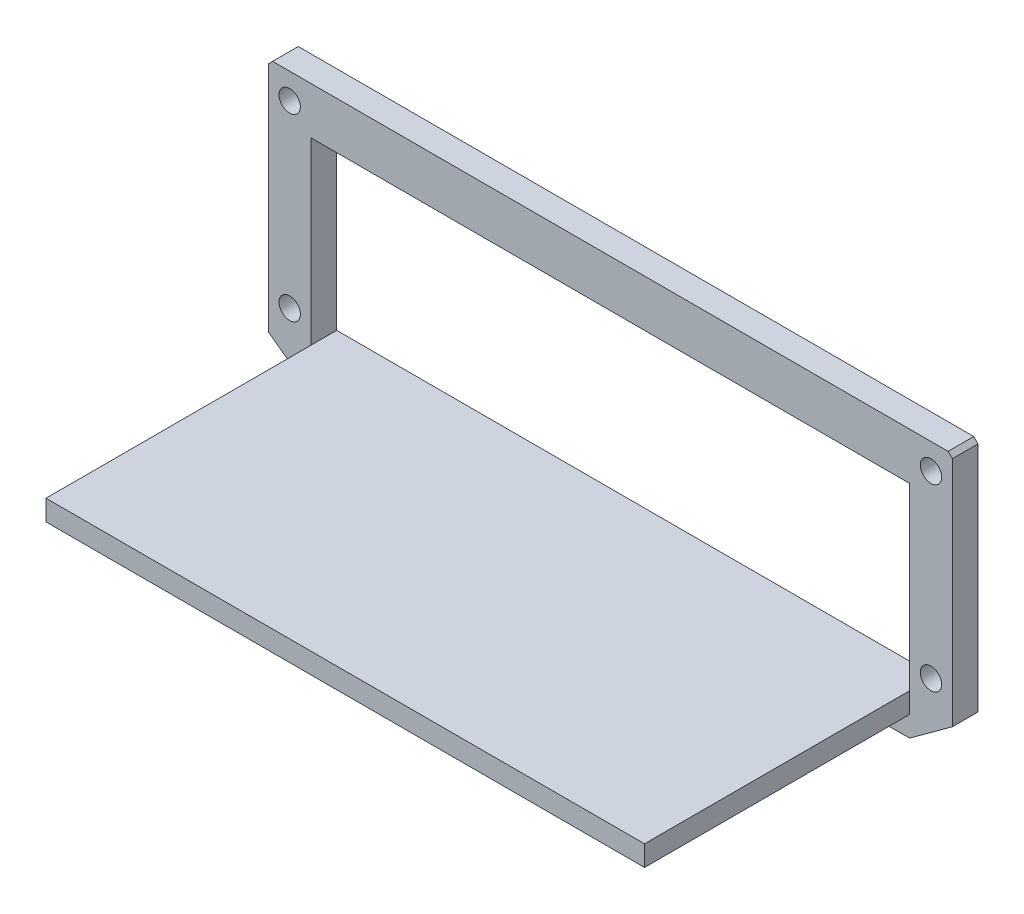
ISO-10303-21;
HEADER;
FILE_DESCRIPTION(('STEP AP214'),'2;1');
FILE_NAME('part.step','',(''),(''),'','','');
FILE_SCHEMA(('AUTOMOTIVE_DESIGN { 1 0 10303 214 1 1 1 1 }'));
ENDSEC;
DATA;
#1=APPLICATION_CONTEXT('core data for automotive mechanical design processes');
#2=APPLICATION_PROTOCOL_DEFINITION('international standard','automotive_design',2000,#1);
#3=PRODUCT_CONTEXT('',#1,'mechanical');
#4=PRODUCT('Part','Part','',(#3));
#5=PRODUCT_RELATED_PRODUCT_CATEGORY('part','',(#4));
#6=PRODUCT_DEFINITION_FORMATION('','',#4);
#7=PRODUCT_DEFINITION_CONTEXT('part definition',#1,'design');
#8=PRODUCT_DEFINITION('design','',#6,#7);
#9=PRODUCT_DEFINITION_SHAPE('','',#8);
#10=(LENGTH_UNIT() NAMED_UNIT(*) SI_UNIT(.MILLI.,.METRE.));
#11=(NAMED_UNIT(*) PLANE_ANGLE_UNIT() SI_UNIT($,.RADIAN.));
#12=(NAMED_UNIT(*) SI_UNIT($,.STERADIAN.) SOLID_ANGLE_UNIT());
#13=UNCERTAINTY_MEASURE_WITH_UNIT(LENGTH_MEASURE(1.E-05),#10,'distance_accuracy_value','');
#14=(GEOMETRIC_REPRESENTATION_CONTEXT(3) GLOBAL_UNCERTAINTY_ASSIGNED_CONTEXT((#13)) GLOBAL_UNIT_ASSIGNED_CONTEXT((#10,
#11,#12)) REPRESENTATION_CONTEXT('',''));
#15=CARTESIAN_POINT('',(0.,0.,0.));
#16=DIRECTION('',(0.,0.,1.));
#17=DIRECTION('',(1.,0.,0.));
#18=AXIS2_PLACEMENT_3D('',#15,#16,#17);
#19=CARTESIAN_POINT('',(-40.,-17.,3.));
#20=DIRECTION('',(0.,0.,1.));
#21=DIRECTION('',(1.,0.,0.));
#22=AXIS2_PLACEMENT_3D('',#19,#20,#21);
#23=PLANE('',#22);
#24=DIRECTION('',(0.,-1.,0.));
#25=VECTOR('',#24,1.);
#26=CARTESIAN_POINT('',(-35.,-11.5,3.));
#27=LINE('',#26,#25);
#28=CARTESIAN_POINT('',(-35.,-9.5,3.));
#29=VERTEX_POINT('',#28);
#30=CARTESIAN_POINT('',(-35.,-11.9,3.));
#31=VERTEX_POINT('',#30);
#32=EDGE_CURVE('E158',#29,#31,#27,.T.);
#33=ORIENTED_EDGE('',*,*,#32,.F.);
#34=DIRECTION('',(0.,-1.,0.));
#35=VECTOR('',#34,1.);
#36=CARTESIAN_POINT('',(-35.,11.5,3.));
#37=LINE('',#36,#35);
#38=CARTESIAN_POINT('',(-35.,11.5,3.));
#39=VERTEX_POINT('',#38);
#40=EDGE_CURVE('E221',#39,#29,#37,.T.);
#41=ORIENTED_EDGE('',*,*,#40,.F.);
#42=DIRECTION('',(-1.,0.,0.));
#43=VECTOR('',#42,1.);
#44=CARTESIAN_POINT('',(-35.,11.5,3.));
#45=LINE('',#44,#43);
#46=CARTESIAN_POINT('',(35.,11.5,3.));
#47=VERTEX_POINT('',#46);
#48=EDGE_CURVE('E234',#47,#39,#45,.T.);
#49=ORIENTED_EDGE('',*,*,#48,.F.);
#50=DIRECTION('',(0.,1.,0.));
#51=VECTOR('',#50,1.);
#52=CARTESIAN_POINT('',(35.,11.5,3.));
#53=LINE('',#52,#51);
#54=CARTESIAN_POINT('',(35.,-9.5,3.));
#55=VERTEX_POINT('',#54);
#56=EDGE_CURVE('E232',#55,#47,#53,.T.);
#57=ORIENTED_EDGE('',*,*,#56,.F.);
#58=DIRECTION('',(0.,1.,0.));
#59=VECTOR('',#58,1.);
#60=CARTESIAN_POINT('',(35.,-11.9,3.));
#61=LINE('',#60,#59);
#62=CARTESIAN_POINT('',(35.,-11.9,3.));
#63=VERTEX_POINT('',#62);
#64=EDGE_CURVE('E55',#63,#55,#61,.T.);
#65=ORIENTED_EDGE('',*,*,#64,.F.);
#66=DIRECTION('',(1.,0.,0.));
#67=VECTOR('',#66,1.);
#68=CARTESIAN_POINT('',(-35.,-11.9,3.));
#69=LINE('',#68,#67);
#70=EDGE_CURVE('E50',#31,#63,#69,.T.);
#71=ORIENTED_EDGE('',*,*,#70,.F.);
#72=EDGE_LOOP('',(#33,#41,#49,#57,#65,#71));
#73=FACE_BOUND('',#72,.T.);
#74=DIRECTION('',(0.807621374925712,0.589701377616758,0.));
#75=VECTOR('',#74,1.);
#76=CARTESIAN_POINT('',(40.,-10.6491470389141,3.));
#77=LINE('',#76,#75);
#78=CARTESIAN_POINT('',(35.,-14.3,3.));
#79=VERTEX_POINT('',#78);
#80=CARTESIAN_POINT('',(40.,-10.6491470389141,3.));
#81=VERTEX_POINT('',#80);
#82=EDGE_CURVE('E189',#79,#81,#77,.T.);
#83=ORIENTED_EDGE('',*,*,#82,.T.);
#84=DIRECTION('',(0.,1.,0.));
#85=VECTOR('',#84,1.);
#86=CARTESIAN_POINT('',(40.,17.,3.));
#87=LINE('',#86,#85);
#88=CARTESIAN_POINT('',(40.,16.5,3.));
#89=VERTEX_POINT('',#88);
#90=EDGE_CURVE('E244',#81,#89,#87,.T.);
#91=ORIENTED_EDGE('',*,*,#90,.T.);
#92=DIRECTION('',(0.707106781186543,-0.707106781186552,0.));
#93=VECTOR('',#92,1.);
#94=CARTESIAN_POINT('',(16.7500000000006,39.7499999999998,3.));
#95=LINE('',#94,#93);
#96=CARTESIAN_POINT('',(39.5,17.,3.));
#97=VERTEX_POINT('',#96);
#98=EDGE_CURVE('E268',#89,#97,#95,.F.);
#99=ORIENTED_EDGE('',*,*,#98,.T.);
#100=DIRECTION('',(-1.,0.,0.));
#101=VECTOR('',#100,1.);
#102=CARTESIAN_POINT('',(-40.,17.,3.));
#103=LINE('',#102,#101);
#104=CARTESIAN_POINT('',(-39.5,17.,3.));
#105=VERTEX_POINT('',#104);
#106=EDGE_CURVE('E247',#97,#105,#103,.T.);
#107=ORIENTED_EDGE('',*,*,#106,.T.);
#108=DIRECTION('',(0.707106781186552,0.707106781186543,0.));
#109=VECTOR('',#108,1.);
#110=CARTESIAN_POINT('',(-56.75,-0.249999999999764,3.));
#111=LINE('',#110,#109);
#112=CARTESIAN_POINT('',(-40.,16.5,3.));
#113=VERTEX_POINT('',#112);
#114=EDGE_CURVE('E270',#105,#113,#111,.F.);
#115=ORIENTED_EDGE('',*,*,#114,.T.);
#116=DIRECTION('',(0.,-1.,0.));
#117=VECTOR('',#116,1.);
#118=CARTESIAN_POINT('',(-40.,17.,3.));
#119=LINE('',#118,#117);
#120=CARTESIAN_POINT('',(-40.,-10.6491470389141,3.));
#121=VERTEX_POINT('',#120);
#122=EDGE_CURVE('E241',#113,#121,#119,.T.);
#123=ORIENTED_EDGE('',*,*,#122,.T.);
#124=DIRECTION('',(0.807621374925712,-0.589701377616758,0.));
#125=VECTOR('',#124,1.);
#126=CARTESIAN_POINT('',(-35.,-14.3,3.));
#127=LINE('',#126,#125);
#128=CARTESIAN_POINT('',(-35.,-14.3,3.));
#129=VERTEX_POINT('',#128);
#130=EDGE_CURVE('E180',#121,#129,#127,.T.);
#131=ORIENTED_EDGE('',*,*,#130,.T.);
#132=DIRECTION('',(1.,0.,0.));
#133=VECTOR('',#132,1.);
#134=CARTESIAN_POINT('',(-35.,-14.3,3.));
#135=LINE('',#134,#133);
#136=EDGE_CURVE('E173',#129,#79,#135,.T.);
#137=ORIENTED_EDGE('',*,*,#136,.T.);
#138=EDGE_LOOP('',(#83,#91,#99,#107,#115,#123,#131,#137));
#139=FACE_BOUND('',#138,.T.);
#140=CARTESIAN_POINT('',(37.5,-6.99999999999999,3.));
#141=DIRECTION('',(0.,0.,-1.));
#142=DIRECTION('',(-1.,0.,0.));
#143=AXIS2_PLACEMENT_3D('',#140,#141,#142);
#144=CIRCLE('',#143,1.25);
#145=CARTESIAN_POINT('',(36.25,-6.99999999999999,3.));
#146=VERTEX_POINT('',#145);
#147=EDGE_CURVE('E218',#146,#146,#144,.T.);
#148=ORIENTED_EDGE('',*,*,#147,.T.);
#149=EDGE_LOOP('',(#148));
#150=FACE_BOUND('',#149,.T.);
#151=CARTESIAN_POINT('',(37.5,14.,3.));
#152=DIRECTION('',(0.,0.,-1.));
#153=DIRECTION('',(-1.,0.,0.));
#154=AXIS2_PLACEMENT_3D('',#151,#152,#153);
#155=CIRCLE('',#154,1.25);
#156=CARTESIAN_POINT('',(36.25,14.,3.));
#157=VERTEX_POINT('',#156);
#158=EDGE_CURVE('E212',#157,#157,#155,.T.);
#159=ORIENTED_EDGE('',*,*,#158,.T.);
#160=EDGE_LOOP('',(#159));
#161=FACE_BOUND('',#160,.T.);
#162=CARTESIAN_POINT('',(-37.5,14.,3.));
#163=DIRECTION('',(0.,0.,-1.));
#164=DIRECTION('',(-1.,0.,0.));
#165=AXIS2_PLACEMENT_3D('',#162,#163,#164);
#166=CIRCLE('',#165,1.25);
#167=CARTESIAN_POINT('',(-38.75,14.,3.));
#168=VERTEX_POINT('',#167);
#169=EDGE_CURVE('E206',#168,#168,#166,.T.);
#170=ORIENTED_EDGE('',*,*,#169,.T.);
#171=EDGE_LOOP('',(#170));
#172=FACE_BOUND('',#171,.T.);
#173=CARTESIAN_POINT('',(-37.5,-7.,3.));
#174=DIRECTION('',(0.,0.,-1.));
#175=DIRECTION('',(-1.,0.,0.));
#176=AXIS2_PLACEMENT_3D('',#173,#174,#175);
#177=CIRCLE('',#176,1.25);
#178=CARTESIAN_POINT('',(-38.75,-7.,3.));
#179=VERTEX_POINT('',#178);
#180=EDGE_CURVE('E200',#179,#179,#177,.T.);
#181=ORIENTED_EDGE('',*,*,#180,.T.);
#182=EDGE_LOOP('',(#181));
#183=FACE_BOUND('',#182,.T.);
#184=ADVANCED_FACE('F35',(#73,#139,#150,#161,#172,#183),#23,.T.);
#185=CARTESIAN_POINT('',(-40.,-17.,0.));
#186=DIRECTION('',(0.,0.,1.));
#187=DIRECTION('',(1.,0.,0.));
#188=AXIS2_PLACEMENT_3D('',#185,#186,#187);
#189=PLANE('',#188);
#190=DIRECTION('',(0.,1.,0.));
#191=VECTOR('',#190,1.);
#192=CARTESIAN_POINT('',(-35.,11.5,0.));
#193=LINE('',#192,#191);
#194=CARTESIAN_POINT('',(-35.,-9.5,0.));
#195=VERTEX_POINT('',#194);
#196=CARTESIAN_POINT('',(-35.,11.5,0.));
#197=VERTEX_POINT('',#196);
#198=EDGE_CURVE('E227',#195,#197,#193,.T.);
#199=ORIENTED_EDGE('',*,*,#198,.F.);
#200=DIRECTION('',(-1.,0.,0.));
#201=VECTOR('',#200,1.);
#202=CARTESIAN_POINT('',(-35.,-9.5,0.));
#203=LINE('',#202,#201);
#204=CARTESIAN_POINT('',(35.,-9.5,0.));
#205=VERTEX_POINT('',#204);
#206=EDGE_CURVE('E161',#205,#195,#203,.T.);
#207=ORIENTED_EDGE('',*,*,#206,.F.);
#208=DIRECTION('',(0.,-1.,0.));
#209=VECTOR('',#208,1.);
#210=CARTESIAN_POINT('',(35.,11.5,0.));
#211=LINE('',#210,#209);
#212=CARTESIAN_POINT('',(35.,11.5,0.));
#213=VERTEX_POINT('',#212);
#214=EDGE_CURVE('E222',#213,#205,#211,.T.);
#215=ORIENTED_EDGE('',*,*,#214,.F.);
#216=DIRECTION('',(1.,0.,0.));
#217=VECTOR('',#216,1.);
#218=CARTESIAN_POINT('',(-35.,11.5,0.));
#219=LINE('',#218,#217);
#220=EDGE_CURVE('E224',#197,#213,#219,.T.);
#221=ORIENTED_EDGE('',*,*,#220,.F.);
#222=EDGE_LOOP('',(#199,#207,#215,#221));
#223=FACE_BOUND('',#222,.T.);
#224=DIRECTION('',(0.807621374925712,-0.589701377616758,0.));
#225=VECTOR('',#224,1.);
#226=CARTESIAN_POINT('',(-35.,-14.3,0.));
#227=LINE('',#226,#225);
#228=CARTESIAN_POINT('',(-40.,-10.6491470389141,0.));
#229=VERTEX_POINT('',#228);
#230=CARTESIAN_POINT('',(-35.,-14.3,0.));
#231=VERTEX_POINT('',#230);
#232=EDGE_CURVE('E183',#229,#231,#227,.T.);
#233=ORIENTED_EDGE('',*,*,#232,.F.);
#234=DIRECTION('',(0.,-1.,0.));
#235=VECTOR('',#234,1.);
#236=CARTESIAN_POINT('',(-40.,17.,0.));
#237=LINE('',#236,#235);
#238=CARTESIAN_POINT('',(-40.,16.5,0.));
#239=VERTEX_POINT('',#238);
#240=EDGE_CURVE('E229',#239,#229,#237,.T.);
#241=ORIENTED_EDGE('',*,*,#240,.F.);
#242=DIRECTION('',(-0.707106781186552,-0.707106781186543,0.));
#243=VECTOR('',#242,1.);
#244=CARTESIAN_POINT('',(-40.,16.5,0.));
#245=LINE('',#244,#243);
#246=CARTESIAN_POINT('',(-39.5,17.,0.));
#247=VERTEX_POINT('',#246);
#248=EDGE_CURVE('E261',#239,#247,#245,.F.);
#249=ORIENTED_EDGE('',*,*,#248,.T.);
#250=DIRECTION('',(-1.,0.,0.));
#251=VECTOR('',#250,1.);
#252=CARTESIAN_POINT('',(-40.,17.,0.));
#253=LINE('',#252,#251);
#254=CARTESIAN_POINT('',(39.5,17.,0.));
#255=VERTEX_POINT('',#254);
#256=EDGE_CURVE('E245',#255,#247,#253,.T.);
#257=ORIENTED_EDGE('',*,*,#256,.F.);
#258=DIRECTION('',(-0.707106781186543,0.707106781186552,0.));
#259=VECTOR('',#258,1.);
#260=CARTESIAN_POINT('',(39.5,17.,0.));
#261=LINE('',#260,#259);
#262=CARTESIAN_POINT('',(40.,16.5,0.));
#263=VERTEX_POINT('',#262);
#264=EDGE_CURVE('E258',#255,#263,#261,.F.);
#265=ORIENTED_EDGE('',*,*,#264,.T.);
#266=DIRECTION('',(0.,1.,0.));
#267=VECTOR('',#266,1.);
#268=CARTESIAN_POINT('',(40.,17.,0.));
#269=LINE('',#268,#267);
#270=CARTESIAN_POINT('',(40.,-10.6491470389141,0.));
#271=VERTEX_POINT('',#270);
#272=EDGE_CURVE('E252',#271,#263,#269,.T.);
#273=ORIENTED_EDGE('',*,*,#272,.F.);
#274=DIRECTION('',(0.807621374925712,0.589701377616758,0.));
#275=VECTOR('',#274,1.);
#276=CARTESIAN_POINT('',(40.,-10.6491470389141,0.));
#277=LINE('',#276,#275);
#278=CARTESIAN_POINT('',(35.,-14.3,0.));
#279=VERTEX_POINT('',#278);
#280=EDGE_CURVE('E179',#279,#271,#277,.T.);
#281=ORIENTED_EDGE('',*,*,#280,.F.);
#282=DIRECTION('',(1.,0.,0.));
#283=VECTOR('',#282,1.);
#284=CARTESIAN_POINT('',(-35.,-14.3,0.));
#285=LINE('',#284,#283);
#286=EDGE_CURVE('E176',#231,#279,#285,.T.);
#287=ORIENTED_EDGE('',*,*,#286,.F.);
#288=EDGE_LOOP('',(#233,#241,#249,#257,#265,#273,#281,#287));
#289=FACE_BOUND('',#288,.T.);
#290=CARTESIAN_POINT('',(-37.5,-7.,0.));
#291=DIRECTION('',(0.,0.,-1.));
#292=DIRECTION('',(-1.,0.,0.));
#293=AXIS2_PLACEMENT_3D('',#290,#291,#292);
#294=CIRCLE('',#293,1.25);
#295=CARTESIAN_POINT('',(-38.75,-7.,0.));
#296=VERTEX_POINT('',#295);
#297=EDGE_CURVE('E196',#296,#296,#294,.T.);
#298=ORIENTED_EDGE('',*,*,#297,.F.);
#299=EDGE_LOOP('',(#298));
#300=FACE_BOUND('',#299,.T.);
#301=CARTESIAN_POINT('',(37.5,14.,0.));
#302=DIRECTION('',(0.,0.,-1.));
#303=DIRECTION('',(-1.,0.,0.));
#304=AXIS2_PLACEMENT_3D('',#301,#302,#303);
#305=CIRCLE('',#304,1.25);
#306=CARTESIAN_POINT('',(36.25,14.,0.));
#307=VERTEX_POINT('',#306);
#308=EDGE_CURVE('E209',#307,#307,#305,.T.);
#309=ORIENTED_EDGE('',*,*,#308,.F.);
#310=EDGE_LOOP('',(#309));
#311=FACE_BOUND('',#310,.T.);
#312=CARTESIAN_POINT('',(37.5,-6.99999999999999,0.));
#313=DIRECTION('',(0.,0.,-1.));
#314=DIRECTION('',(-1.,0.,0.));
#315=AXIS2_PLACEMENT_3D('',#312,#313,#314);
#316=CIRCLE('',#315,1.25);
#317=CARTESIAN_POINT('',(36.25,-6.99999999999999,0.));
#318=VERTEX_POINT('',#317);
#319=EDGE_CURVE('E215',#318,#318,#316,.T.);
#320=ORIENTED_EDGE('',*,*,#319,.F.);
#321=EDGE_LOOP('',(#320));
#322=FACE_BOUND('',#321,.T.);
#323=CARTESIAN_POINT('',(-37.5,14.,0.));
#324=DIRECTION('',(0.,0.,-1.));
#325=DIRECTION('',(-1.,0.,0.));
#326=AXIS2_PLACEMENT_3D('',#323,#324,#325);
#327=CIRCLE('',#326,1.25);
#328=CARTESIAN_POINT('',(-38.75,14.,0.));
#329=VERTEX_POINT('',#328);
#330=EDGE_CURVE('E203',#329,#329,#327,.T.);
#331=ORIENTED_EDGE('',*,*,#330,.F.);
#332=EDGE_LOOP('',(#331));
#333=FACE_BOUND('',#332,.T.);
#334=ADVANCED_FACE('F283',(#223,#289,#300,#311,#322,#333),#189,.F.);
#335=CARTESIAN_POINT('',(-40.,17.,3.));
#336=DIRECTION('',(1.,0.,0.));
#337=DIRECTION('',(0.,0.,-1.));
#338=AXIS2_PLACEMENT_3D('',#335,#336,#337);
#339=PLANE('',#338);
#340=ORIENTED_EDGE('',*,*,#240,.T.);
#341=DIRECTION('',(0.,0.,1.));
#342=VECTOR('',#341,1.);
#343=CARTESIAN_POINT('',(-40.,-10.6491470389141,3.));
#344=LINE('',#343,#342);
#345=EDGE_CURVE('E11',#229,#121,#344,.T.);
#346=ORIENTED_EDGE('',*,*,#345,.T.);
#347=ORIENTED_EDGE('',*,*,#122,.F.);
#348=DIRECTION('',(0.,0.,-1.));
#349=VECTOR('',#348,1.);
#350=CARTESIAN_POINT('',(-40.,16.5,3.));
#351=LINE('',#350,#349);
#352=EDGE_CURVE('E250',#113,#239,#351,.T.);
#353=ORIENTED_EDGE('',*,*,#352,.T.);
#354=EDGE_LOOP('',(#340,#346,#347,#353));
#355=FACE_BOUND('',#354,.T.);
#356=ADVANCED_FACE('F299',(#355),#339,.F.);
#357=CARTESIAN_POINT('',(40.,17.,3.));
#358=DIRECTION('',(-1.,0.,0.));
#359=DIRECTION('',(0.,0.,1.));
#360=AXIS2_PLACEMENT_3D('',#357,#358,#359);
#361=PLANE('',#360);
#362=ORIENTED_EDGE('',*,*,#90,.F.);
#363=DIRECTION('',(0.,0.,-1.));
#364=VECTOR('',#363,1.);
#365=CARTESIAN_POINT('',(40.,-10.6491470389141,3.));
#366=LINE('',#365,#364);
#367=EDGE_CURVE('E43',#81,#271,#366,.T.);
#368=ORIENTED_EDGE('',*,*,#367,.T.);
#369=ORIENTED_EDGE('',*,*,#272,.T.);
#370=DIRECTION('',(0.,0.,1.));
#371=VECTOR('',#370,1.);
#372=CARTESIAN_POINT('',(40.,16.5,3.));
#373=LINE('',#372,#371);
#374=EDGE_CURVE('E272',#263,#89,#373,.T.);
#375=ORIENTED_EDGE('',*,*,#374,.T.);
#376=EDGE_LOOP('',(#362,#368,#369,#375));
#377=FACE_BOUND('',#376,.T.);
#378=ADVANCED_FACE('F277',(#377),#361,.F.);
#379=CARTESIAN_POINT('',(-40.,17.,3.));
#380=DIRECTION('',(0.,-1.,0.));
#381=DIRECTION('',(0.,0.,-1.));
#382=AXIS2_PLACEMENT_3D('',#379,#380,#381);
#383=PLANE('',#382);
#384=ORIENTED_EDGE('',*,*,#256,.T.);
#385=DIRECTION('',(0.,0.,1.));
#386=VECTOR('',#385,1.);
#387=CARTESIAN_POINT('',(-39.5,17.,3.));
#388=LINE('',#387,#386);
#389=EDGE_CURVE('E266',#247,#105,#388,.T.);
#390=ORIENTED_EDGE('',*,*,#389,.T.);
#391=ORIENTED_EDGE('',*,*,#106,.F.);
#392=DIRECTION('',(0.,0.,-1.));
#393=VECTOR('',#392,1.);
#394=CARTESIAN_POINT('',(39.5,17.,3.));
#395=LINE('',#394,#393);
#396=EDGE_CURVE('E263',#97,#255,#395,.T.);
#397=ORIENTED_EDGE('',*,*,#396,.T.);
#398=EDGE_LOOP('',(#384,#390,#391,#397));
#399=FACE_BOUND('',#398,.T.);
#400=ADVANCED_FACE('F309',(#399),#383,.F.);
#401=CARTESIAN_POINT('',(-35.,11.5,-73.6817480791546));
#402=DIRECTION('',(-1.,0.,0.));
#403=DIRECTION('',(0.,0.,1.));
#404=AXIS2_PLACEMENT_3D('',#401,#402,#403);
#405=PLANE('',#404);
#406=ORIENTED_EDGE('',*,*,#40,.T.);
#407=DIRECTION('',(0.,0.,1.));
#408=VECTOR('',#407,1.);
#409=CARTESIAN_POINT('',(-35.,-9.5,0.));
#410=LINE('',#409,#408);
#411=EDGE_CURVE('E170',#195,#29,#410,.T.);
#412=ORIENTED_EDGE('',*,*,#411,.F.);
#413=ORIENTED_EDGE('',*,*,#198,.T.);
#414=DIRECTION('',(0.,0.,1.));
#415=VECTOR('',#414,1.);
#416=CARTESIAN_POINT('',(-35.,11.5,-73.6817480791546));
#417=LINE('',#416,#415);
#418=EDGE_CURVE('E225',#197,#39,#417,.T.);
#419=ORIENTED_EDGE('',*,*,#418,.T.);
#420=EDGE_LOOP('',(#406,#412,#413,#419));
#421=FACE_BOUND('',#420,.T.);
#422=ADVANCED_FACE('F332',(#421),#405,.F.);
#423=CARTESIAN_POINT('',(-35.,11.5,-73.6817480791546));
#424=DIRECTION('',(0.,1.,0.));
#425=DIRECTION('',(0.,0.,1.));
#426=AXIS2_PLACEMENT_3D('',#423,#424,#425);
#427=PLANE('',#426);
#428=ORIENTED_EDGE('',*,*,#220,.T.);
#429=DIRECTION('',(0.,0.,1.));
#430=VECTOR('',#429,1.);
#431=CARTESIAN_POINT('',(35.,11.5,-73.6817480791546));
#432=LINE('',#431,#430);
#433=EDGE_CURVE('E237',#213,#47,#432,.T.);
#434=ORIENTED_EDGE('',*,*,#433,.T.);
#435=ORIENTED_EDGE('',*,*,#48,.T.);
#436=ORIENTED_EDGE('',*,*,#418,.F.);
#437=EDGE_LOOP('',(#428,#434,#435,#436));
#438=FACE_BOUND('',#437,.T.);
#439=ADVANCED_FACE('F361',(#438),#427,.F.);
#440=CARTESIAN_POINT('',(35.,11.5,-73.6817480791546));
#441=DIRECTION('',(1.,0.,0.));
#442=DIRECTION('',(0.,0.,-1.));
#443=AXIS2_PLACEMENT_3D('',#440,#441,#442);
#444=PLANE('',#443);
#445=ORIENTED_EDGE('',*,*,#214,.T.);
#446=DIRECTION('',(0.,0.,1.));
#447=VECTOR('',#446,1.);
#448=CARTESIAN_POINT('',(35.,-9.5,0.));
#449=LINE('',#448,#447);
#450=EDGE_CURVE('E164',#205,#55,#449,.T.);
#451=ORIENTED_EDGE('',*,*,#450,.T.);
#452=ORIENTED_EDGE('',*,*,#56,.T.);
#453=ORIENTED_EDGE('',*,*,#433,.F.);
#454=EDGE_LOOP('',(#445,#451,#452,#453));
#455=FACE_BOUND('',#454,.T.);
#456=ADVANCED_FACE('F322',(#455),#444,.F.);
#457=CARTESIAN_POINT('',(-40.,16.5,3.));
#458=DIRECTION('',(0.707106781186542,-0.707106781186552,0.));
#459=DIRECTION('',(0.707106781186552,0.707106781186543,0.));
#460=AXIS2_PLACEMENT_3D('',#457,#458,#459);
#461=PLANE('',#460);
#462=ORIENTED_EDGE('',*,*,#114,.F.);
#463=ORIENTED_EDGE('',*,*,#389,.F.);
#464=ORIENTED_EDGE('',*,*,#248,.F.);
#465=ORIENTED_EDGE('',*,*,#352,.F.);
#466=EDGE_LOOP('',(#462,#463,#464,#465));
#467=FACE_BOUND('',#466,.T.);
#468=ADVANCED_FACE('F307',(#467),#461,.F.);
#469=CARTESIAN_POINT('',(39.5,17.,3.));
#470=DIRECTION('',(-0.707106781186552,-0.707106781186543,0.));
#471=DIRECTION('',(0.707106781186543,-0.707106781186552,0.));
#472=AXIS2_PLACEMENT_3D('',#469,#470,#471);
#473=PLANE('',#472);
#474=ORIENTED_EDGE('',*,*,#98,.F.);
#475=ORIENTED_EDGE('',*,*,#374,.F.);
#476=ORIENTED_EDGE('',*,*,#264,.F.);
#477=ORIENTED_EDGE('',*,*,#396,.F.);
#478=EDGE_LOOP('',(#474,#475,#476,#477));
#479=FACE_BOUND('',#478,.T.);
#480=ADVANCED_FACE('F37',(#479),#473,.F.);
#481=CARTESIAN_POINT('',(37.5,-6.99999999999999,0.));
#482=DIRECTION('',(0.,0.,-1.));
#483=DIRECTION('',(-1.,0.,0.));
#484=AXIS2_PLACEMENT_3D('',#481,#482,#483);
#485=CYLINDRICAL_SURFACE('',#484,1.25);
#486=ORIENTED_EDGE('',*,*,#147,.F.);
#487=EDGE_LOOP('',(#486));
#488=FACE_BOUND('',#487,.T.);
#489=ORIENTED_EDGE('',*,*,#319,.T.);
#490=EDGE_LOOP('',(#489));
#491=FACE_BOUND('',#490,.T.);
#492=ADVANCED_FACE('F314',(#488,#491),#485,.F.);
#493=CARTESIAN_POINT('',(37.5,14.,0.));
#494=DIRECTION('',(0.,0.,-1.));
#495=DIRECTION('',(-1.,0.,0.));
#496=AXIS2_PLACEMENT_3D('',#493,#494,#495);
#497=CYLINDRICAL_SURFACE('',#496,1.25);
#498=ORIENTED_EDGE('',*,*,#158,.F.);
#499=EDGE_LOOP('',(#498));
#500=FACE_BOUND('',#499,.T.);
#501=ORIENTED_EDGE('',*,*,#308,.T.);
#502=EDGE_LOOP('',(#501));
#503=FACE_BOUND('',#502,.T.);
#504=ADVANCED_FACE('F319',(#500,#503),#497,.F.);
#505=CARTESIAN_POINT('',(-37.5,14.,0.));
#506=DIRECTION('',(0.,0.,-1.));
#507=DIRECTION('',(-1.,0.,0.));
#508=AXIS2_PLACEMENT_3D('',#505,#506,#507);
#509=CYLINDRICAL_SURFACE('',#508,1.25);
#510=ORIENTED_EDGE('',*,*,#169,.F.);
#511=EDGE_LOOP('',(#510));
#512=FACE_BOUND('',#511,.T.);
#513=ORIENTED_EDGE('',*,*,#330,.T.);
#514=EDGE_LOOP('',(#513));
#515=FACE_BOUND('',#514,.T.);
#516=ADVANCED_FACE('F403',(#512,#515),#509,.F.);
#517=CARTESIAN_POINT('',(-37.5,-7.,0.));
#518=DIRECTION('',(0.,0.,-1.));
#519=DIRECTION('',(-1.,0.,0.));
#520=AXIS2_PLACEMENT_3D('',#517,#518,#519);
#521=CYLINDRICAL_SURFACE('',#520,1.25);
#522=ORIENTED_EDGE('',*,*,#180,.F.);
#523=EDGE_LOOP('',(#522));
#524=FACE_BOUND('',#523,.T.);
#525=ORIENTED_EDGE('',*,*,#297,.T.);
#526=EDGE_LOOP('',(#525));
#527=FACE_BOUND('',#526,.T.);
#528=ADVANCED_FACE('F412',(#524,#527),#521,.F.);
#529=CARTESIAN_POINT('',(-35.,-14.3,0.));
#530=DIRECTION('',(0.,-1.,0.));
#531=DIRECTION('',(0.,0.,-1.));
#532=AXIS2_PLACEMENT_3D('',#529,#530,#531);
#533=PLANE('',#532);
#534=ORIENTED_EDGE('',*,*,#136,.F.);
#535=DIRECTION('',(0.,0.,1.));
#536=VECTOR('',#535,1.);
#537=CARTESIAN_POINT('',(-35.,-14.3,0.));
#538=LINE('',#537,#536);
#539=EDGE_CURVE('E194',#231,#129,#538,.T.);
#540=ORIENTED_EDGE('',*,*,#539,.F.);
#541=ORIENTED_EDGE('',*,*,#286,.T.);
#542=DIRECTION('',(0.,0.,1.));
#543=VECTOR('',#542,1.);
#544=CARTESIAN_POINT('',(35.,-14.3,0.));
#545=LINE('',#544,#543);
#546=EDGE_CURVE('E186',#279,#79,#545,.T.);
#547=ORIENTED_EDGE('',*,*,#546,.T.);
#548=EDGE_LOOP('',(#534,#540,#541,#547));
#549=FACE_BOUND('',#548,.T.);
#550=ADVANCED_FACE('F291',(#549),#533,.T.);
#551=CARTESIAN_POINT('',(-35.,-14.3,0.));
#552=DIRECTION('',(-0.589701377616759,-0.807621374925712,0.));
#553=DIRECTION('',(0.807621374925712,-0.589701377616759,0.));
#554=AXIS2_PLACEMENT_3D('',#551,#552,#553);
#555=PLANE('',#554);
#556=ORIENTED_EDGE('',*,*,#130,.F.);
#557=ORIENTED_EDGE('',*,*,#345,.F.);
#558=ORIENTED_EDGE('',*,*,#232,.T.);
#559=ORIENTED_EDGE('',*,*,#539,.T.);
#560=EDGE_LOOP('',(#556,#557,#558,#559));
#561=FACE_BOUND('',#560,.T.);
#562=ADVANCED_FACE('F296',(#561),#555,.T.);
#563=CARTESIAN_POINT('',(40.,-10.6491470389141,0.));
#564=DIRECTION('',(0.589701377616759,-0.807621374925712,0.));
#565=DIRECTION('',(0.807621374925712,0.589701377616759,0.));
#566=AXIS2_PLACEMENT_3D('',#563,#564,#565);
#567=PLANE('',#566);
#568=ORIENTED_EDGE('',*,*,#82,.F.);
#569=ORIENTED_EDGE('',*,*,#546,.F.);
#570=ORIENTED_EDGE('',*,*,#280,.T.);
#571=ORIENTED_EDGE('',*,*,#367,.F.);
#572=EDGE_LOOP('',(#568,#569,#570,#571));
#573=FACE_BOUND('',#572,.T.);
#574=ADVANCED_FACE('F288',(#573),#567,.T.);
#575=CARTESIAN_POINT('',(-35.,-9.5,0.));
#576=DIRECTION('',(0.,1.,0.));
#577=DIRECTION('',(0.,0.,1.));
#578=AXIS2_PLACEMENT_3D('',#575,#576,#577);
#579=PLANE('',#578);
#580=ORIENTED_EDGE('',*,*,#411,.T.);
#581=DIRECTION('',(0.,0.,-1.));
#582=VECTOR('',#581,1.);
#583=CARTESIAN_POINT('',(-35.,-9.5,34.));
#584=LINE('',#583,#582);
#585=CARTESIAN_POINT('',(-35.,-9.5,34.));
#586=VERTEX_POINT('',#585);
#587=EDGE_CURVE('E506',#586,#29,#584,.T.);
#588=ORIENTED_EDGE('',*,*,#587,.F.);
#589=DIRECTION('',(-1.,0.,0.));
#590=VECTOR('',#589,1.);
#591=CARTESIAN_POINT('',(-35.,-9.5,34.));
#592=LINE('',#591,#590);
#593=CARTESIAN_POINT('',(35.,-9.5,34.));
#594=VERTEX_POINT('',#593);
#595=EDGE_CURVE('E154',#594,#586,#592,.T.);
#596=ORIENTED_EDGE('',*,*,#595,.F.);
#597=DIRECTION('',(0.,0.,-1.));
#598=VECTOR('',#597,1.);
#599=CARTESIAN_POINT('',(35.,-9.5,34.));
#600=LINE('',#599,#598);
#601=EDGE_CURVE('E166',#594,#55,#600,.T.);
#602=ORIENTED_EDGE('',*,*,#601,.T.);
#603=ORIENTED_EDGE('',*,*,#450,.F.);
#604=ORIENTED_EDGE('',*,*,#206,.T.);
#605=EDGE_LOOP('',(#580,#588,#596,#602,#603,#604));
#606=FACE_BOUND('',#605,.T.);
#607=ADVANCED_FACE('F440',(#606),#579,.T.);
#608=CARTESIAN_POINT('',(-35.,-11.9,34.));
#609=DIRECTION('',(0.,1.,0.));
#610=DIRECTION('',(0.,0.,1.));
#611=AXIS2_PLACEMENT_3D('',#608,#609,#610);
#612=PLANE('',#611);
#613=ORIENTED_EDGE('',*,*,#70,.T.);
#614=DIRECTION('',(0.,0.,-1.));
#615=VECTOR('',#614,1.);
#616=CARTESIAN_POINT('',(35.,-11.9,34.));
#617=LINE('',#616,#615);
#618=CARTESIAN_POINT('',(35.,-11.9,34.));
#619=VERTEX_POINT('',#618);
#620=EDGE_CURVE('E145',#619,#63,#617,.T.);
#621=ORIENTED_EDGE('',*,*,#620,.F.);
#622=DIRECTION('',(1.,0.,0.));
#623=VECTOR('',#622,1.);
#624=CARTESIAN_POINT('',(-35.,-11.9,34.));
#625=LINE('',#624,#623);
#626=CARTESIAN_POINT('',(-35.,-11.9,34.));
#627=VERTEX_POINT('',#626);
#628=EDGE_CURVE('E139',#627,#619,#625,.T.);
#629=ORIENTED_EDGE('',*,*,#628,.F.);
#630=DIRECTION('',(0.,0.,-1.));
#631=VECTOR('',#630,1.);
#632=CARTESIAN_POINT('',(-35.,-11.9,34.));
#633=LINE('',#632,#631);
#634=EDGE_CURVE('E143',#627,#31,#633,.T.);
#635=ORIENTED_EDGE('',*,*,#634,.T.);
#636=EDGE_LOOP('',(#613,#621,#629,#635));
#637=FACE_BOUND('',#636,.T.);
#638=ADVANCED_FACE('F141',(#637),#612,.F.);
#639=CARTESIAN_POINT('',(35.,-11.9,34.));
#640=DIRECTION('',(-1.,0.,0.));
#641=DIRECTION('',(0.,0.,1.));
#642=AXIS2_PLACEMENT_3D('',#639,#640,#641);
#643=PLANE('',#642);
#644=ORIENTED_EDGE('',*,*,#64,.T.);
#645=ORIENTED_EDGE('',*,*,#601,.F.);
#646=DIRECTION('',(0.,1.,0.));
#647=VECTOR('',#646,1.);
#648=CARTESIAN_POINT('',(35.,-11.9,34.));
#649=LINE('',#648,#647);
#650=EDGE_CURVE('E148',#619,#594,#649,.T.);
#651=ORIENTED_EDGE('',*,*,#650,.F.);
#652=ORIENTED_EDGE('',*,*,#620,.T.);
#653=EDGE_LOOP('',(#644,#645,#651,#652));
#654=FACE_BOUND('',#653,.T.);
#655=ADVANCED_FACE('F464',(#654),#643,.F.);
#656=CARTESIAN_POINT('',(-35.,-11.5,34.));
#657=DIRECTION('',(1.,0.,0.));
#658=DIRECTION('',(0.,0.,-1.));
#659=AXIS2_PLACEMENT_3D('',#656,#657,#658);
#660=PLANE('',#659);
#661=ORIENTED_EDGE('',*,*,#32,.T.);
#662=ORIENTED_EDGE('',*,*,#634,.F.);
#663=DIRECTION('',(0.,-1.,0.));
#664=VECTOR('',#663,1.);
#665=CARTESIAN_POINT('',(-35.,-11.5,34.));
#666=LINE('',#665,#664);
#667=EDGE_CURVE('E149',#586,#627,#666,.T.);
#668=ORIENTED_EDGE('',*,*,#667,.F.);
#669=ORIENTED_EDGE('',*,*,#587,.T.);
#670=EDGE_LOOP('',(#661,#662,#668,#669));
#671=FACE_BOUND('',#670,.T.);
#672=ADVANCED_FACE('F160',(#671),#660,.F.);
#673=CARTESIAN_POINT('',(0.,0.,34.));
#674=DIRECTION('',(0.,0.,1.));
#675=DIRECTION('',(1.,0.,0.));
#676=AXIS2_PLACEMENT_3D('',#673,#674,#675);
#677=PLANE('',#676);
#678=ORIENTED_EDGE('',*,*,#667,.T.);
#679=ORIENTED_EDGE('',*,*,#628,.T.);
#680=ORIENTED_EDGE('',*,*,#650,.T.);
#681=ORIENTED_EDGE('',*,*,#595,.T.);
#682=EDGE_LOOP('',(#678,#679,#680,#681));
#683=FACE_BOUND('',#682,.T.);
#684=ADVANCED_FACE('F152',(#683),#677,.T.);
#685=CLOSED_SHELL('',(#184,#334,#356,#378,#400,#422,#439,#456,#468,#480,#492,#504,#516,#528,
#550,#562,#574,#607,#638,#655,#672,#684));
#686=MANIFOLD_SOLID_BREP('B2',#685);
#687=ADVANCED_BREP_SHAPE_REPRESENTATION('',(#18,#686),#14);
#688=SHAPE_DEFINITION_REPRESENTATION(#9,#687);
ENDSEC;
END-ISO-10303-21;
